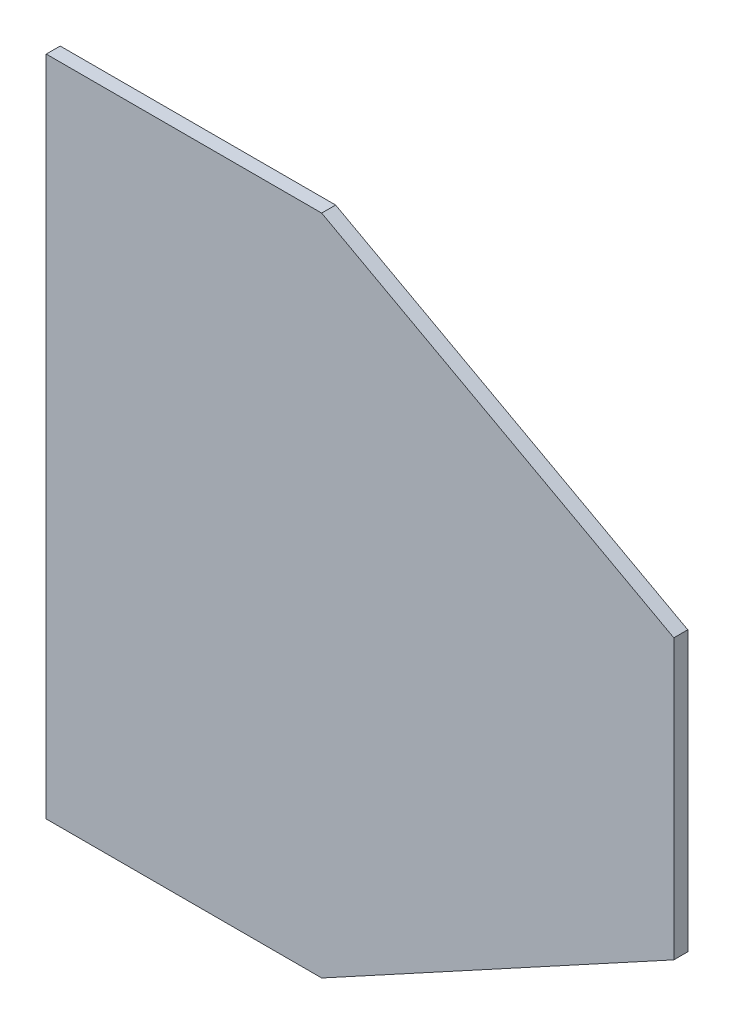
ISO-10303-21;
HEADER;
FILE_DESCRIPTION(('STEP AP214'),'2;1');
FILE_NAME('part.step','',(''),(''),'','','');
FILE_SCHEMA(('AUTOMOTIVE_DESIGN { 1 0 10303 214 1 1 1 1 }'));
ENDSEC;
DATA;
#1=APPLICATION_CONTEXT('core data for automotive mechanical design processes');
#2=APPLICATION_PROTOCOL_DEFINITION('international standard','automotive_design',2000,#1);
#3=PRODUCT_CONTEXT('',#1,'mechanical');
#4=PRODUCT('Part','Part','',(#3));
#5=PRODUCT_RELATED_PRODUCT_CATEGORY('part','',(#4));
#6=PRODUCT_DEFINITION_FORMATION('','',#4);
#7=PRODUCT_DEFINITION_CONTEXT('part definition',#1,'design');
#8=PRODUCT_DEFINITION('design','',#6,#7);
#9=PRODUCT_DEFINITION_SHAPE('','',#8);
#10=(LENGTH_UNIT() NAMED_UNIT(*) SI_UNIT(.MILLI.,.METRE.));
#11=(NAMED_UNIT(*) PLANE_ANGLE_UNIT() SI_UNIT($,.RADIAN.));
#12=(NAMED_UNIT(*) SI_UNIT($,.STERADIAN.) SOLID_ANGLE_UNIT());
#13=UNCERTAINTY_MEASURE_WITH_UNIT(LENGTH_MEASURE(1.E-05),#10,'distance_accuracy_value','');
#14=(GEOMETRIC_REPRESENTATION_CONTEXT(3) GLOBAL_UNCERTAINTY_ASSIGNED_CONTEXT((#13)) GLOBAL_UNIT_ASSIGNED_CONTEXT((#10,
#11,#12)) REPRESENTATION_CONTEXT('',''));
#15=CARTESIAN_POINT('',(0.,0.,0.));
#16=DIRECTION('',(0.,0.,1.));
#17=DIRECTION('',(1.,0.,0.));
#18=AXIS2_PLACEMENT_3D('',#15,#16,#17);
#19=CARTESIAN_POINT('',(136.000000002653,-8.99999999990882,4.));
#20=DIRECTION('',(-0.478242788883094,0.878227666884459,0.));
#21=DIRECTION('',(-0.878227666884459,-0.478242788883094,0.));
#22=AXIS2_PLACEMENT_3D('',#19,#20,#21);
#23=PLANE('',#22);
#24=DIRECTION('',(0.878227666884459,0.478242788883094,0.));
#25=VECTOR('',#24,1.);
#26=CARTESIAN_POINT('',(136.000000002653,-8.99999999990882,0.));
#27=LINE('',#26,#25);
#28=CARTESIAN_POINT('',(34.9999999996149,-63.9999999999088,0.));
#29=VERTEX_POINT('',#28);
#30=CARTESIAN_POINT('',(136.000000002653,-8.99999999990882,0.));
#31=VERTEX_POINT('',#30);
#32=EDGE_CURVE('E117',#29,#31,#27,.T.);
#33=ORIENTED_EDGE('',*,*,#32,.T.);
#34=DIRECTION('',(0.,0.,-1.));
#35=VECTOR('',#34,1.);
#36=CARTESIAN_POINT('',(136.000000002653,-8.99999999990882,4.));
#37=LINE('',#36,#35);
#38=CARTESIAN_POINT('',(136.000000002653,-8.99999999990882,4.));
#39=VERTEX_POINT('',#38);
#40=EDGE_CURVE('E11',#39,#31,#37,.T.);
#41=ORIENTED_EDGE('',*,*,#40,.F.);
#42=DIRECTION('',(0.878227666884459,0.478242788883094,0.));
#43=VECTOR('',#42,1.);
#44=CARTESIAN_POINT('',(136.000000002653,-8.99999999990882,4.));
#45=LINE('',#44,#43);
#46=CARTESIAN_POINT('',(34.9999999996149,-63.9999999999088,4.));
#47=VERTEX_POINT('',#46);
#48=EDGE_CURVE('E127',#47,#39,#45,.T.);
#49=ORIENTED_EDGE('',*,*,#48,.F.);
#50=DIRECTION('',(0.,0.,-1.));
#51=VECTOR('',#50,1.);
#52=CARTESIAN_POINT('',(34.9999999996149,-63.9999999999088,4.));
#53=LINE('',#52,#51);
#54=EDGE_CURVE('E113',#47,#29,#53,.T.);
#55=ORIENTED_EDGE('',*,*,#54,.T.);
#56=EDGE_LOOP('',(#33,#41,#49,#55));
#57=FACE_BOUND('',#56,.T.);
#58=ADVANCED_FACE('F33',(#57),#23,.F.);
#59=CARTESIAN_POINT('',(136.000000002653,71.0000000000912,4.));
#60=DIRECTION('',(-1.,0.,0.));
#61=DIRECTION('',(0.,0.,1.));
#62=AXIS2_PLACEMENT_3D('',#59,#60,#61);
#63=PLANE('',#62);
#64=DIRECTION('',(0.,1.,0.));
#65=VECTOR('',#64,1.);
#66=CARTESIAN_POINT('',(136.000000002653,71.0000000000912,0.));
#67=LINE('',#66,#65);
#68=CARTESIAN_POINT('',(136.000000002653,71.0000000000912,0.));
#69=VERTEX_POINT('',#68);
#70=EDGE_CURVE('E120',#31,#69,#67,.T.);
#71=ORIENTED_EDGE('',*,*,#70,.T.);
#72=DIRECTION('',(0.,0.,-1.));
#73=VECTOR('',#72,1.);
#74=CARTESIAN_POINT('',(136.000000002653,71.0000000000912,4.));
#75=LINE('',#74,#73);
#76=CARTESIAN_POINT('',(136.000000002653,71.0000000000912,4.));
#77=VERTEX_POINT('',#76);
#78=EDGE_CURVE('E41',#77,#69,#75,.T.);
#79=ORIENTED_EDGE('',*,*,#78,.F.);
#80=DIRECTION('',(0.,1.,0.));
#81=VECTOR('',#80,1.);
#82=CARTESIAN_POINT('',(136.000000002653,71.0000000000912,4.));
#83=LINE('',#82,#81);
#84=EDGE_CURVE('E86',#39,#77,#83,.T.);
#85=ORIENTED_EDGE('',*,*,#84,.F.);
#86=ORIENTED_EDGE('',*,*,#40,.T.);
#87=EDGE_LOOP('',(#71,#79,#85,#86));
#88=FACE_BOUND('',#87,.T.);
#89=ADVANCED_FACE('F151',(#88),#63,.F.);
#90=CARTESIAN_POINT('',(34.9999999995747,126.000000000091,4.));
#91=DIRECTION('',(-0.478242788882947,-0.878227666884539,0.));
#92=DIRECTION('',(0.878227666884539,-0.478242788882947,0.));
#93=AXIS2_PLACEMENT_3D('',#90,#91,#92);
#94=PLANE('',#93);
#95=DIRECTION('',(-0.878227666884539,0.478242788882947,0.));
#96=VECTOR('',#95,1.);
#97=CARTESIAN_POINT('',(34.9999999995747,126.000000000091,0.));
#98=LINE('',#97,#96);
#99=CARTESIAN_POINT('',(34.9999999995747,126.000000000091,0.));
#100=VERTEX_POINT('',#99);
#101=EDGE_CURVE('E122',#69,#100,#98,.T.);
#102=ORIENTED_EDGE('',*,*,#101,.T.);
#103=DIRECTION('',(0.,0.,-1.));
#104=VECTOR('',#103,1.);
#105=CARTESIAN_POINT('',(34.9999999995747,126.000000000091,4.));
#106=LINE('',#105,#104);
#107=CARTESIAN_POINT('',(34.9999999995747,126.000000000091,4.));
#108=VERTEX_POINT('',#107);
#109=EDGE_CURVE('E108',#108,#100,#106,.T.);
#110=ORIENTED_EDGE('',*,*,#109,.F.);
#111=DIRECTION('',(-0.878227666884539,0.478242788882947,0.));
#112=VECTOR('',#111,1.);
#113=CARTESIAN_POINT('',(34.9999999995747,126.000000000091,4.));
#114=LINE('',#113,#112);
#115=EDGE_CURVE('E99',#77,#108,#114,.T.);
#116=ORIENTED_EDGE('',*,*,#115,.F.);
#117=ORIENTED_EDGE('',*,*,#78,.T.);
#118=EDGE_LOOP('',(#102,#110,#116,#117));
#119=FACE_BOUND('',#118,.T.);
#120=ADVANCED_FACE('F133',(#119),#94,.F.);
#121=CARTESIAN_POINT('',(-43.9999999973474,126.000000000092,4.));
#122=DIRECTION('',(0.,-1.,0.));
#123=DIRECTION('',(1.,0.,0.));
#124=AXIS2_PLACEMENT_3D('',#121,#122,#123);
#125=PLANE('',#124);
#126=DIRECTION('',(-1.,0.,0.));
#127=VECTOR('',#126,1.);
#128=CARTESIAN_POINT('',(-43.9999999973474,126.000000000092,0.));
#129=LINE('',#128,#127);
#130=CARTESIAN_POINT('',(-43.9999999973474,126.000000000092,0.));
#131=VERTEX_POINT('',#130);
#132=EDGE_CURVE('E107',#100,#131,#129,.T.);
#133=ORIENTED_EDGE('',*,*,#132,.T.);
#134=DIRECTION('',(0.,0.,-1.));
#135=VECTOR('',#134,1.);
#136=CARTESIAN_POINT('',(-43.9999999973474,126.000000000092,4.));
#137=LINE('',#136,#135);
#138=CARTESIAN_POINT('',(-43.9999999973474,126.000000000092,4.));
#139=VERTEX_POINT('',#138);
#140=EDGE_CURVE('E104',#139,#131,#137,.T.);
#141=ORIENTED_EDGE('',*,*,#140,.F.);
#142=DIRECTION('',(-1.,0.,0.));
#143=VECTOR('',#142,1.);
#144=CARTESIAN_POINT('',(-43.9999999973474,126.000000000092,4.));
#145=LINE('',#144,#143);
#146=EDGE_CURVE('E93',#108,#139,#145,.T.);
#147=ORIENTED_EDGE('',*,*,#146,.F.);
#148=ORIENTED_EDGE('',*,*,#109,.T.);
#149=EDGE_LOOP('',(#133,#141,#147,#148));
#150=FACE_BOUND('',#149,.T.);
#151=ADVANCED_FACE('F105',(#150),#125,.F.);
#152=CARTESIAN_POINT('',(-43.9999999973474,-63.9999999999088,4.));
#153=DIRECTION('',(1.,0.,0.));
#154=DIRECTION('',(0.,0.,-1.));
#155=AXIS2_PLACEMENT_3D('',#152,#153,#154);
#156=PLANE('',#155);
#157=DIRECTION('',(0.,-1.,0.));
#158=VECTOR('',#157,1.);
#159=CARTESIAN_POINT('',(-43.9999999973474,-63.9999999999088,0.));
#160=LINE('',#159,#158);
#161=CARTESIAN_POINT('',(-43.9999999973474,-63.9999999999088,0.));
#162=VERTEX_POINT('',#161);
#163=EDGE_CURVE('E72',#131,#162,#160,.T.);
#164=ORIENTED_EDGE('',*,*,#163,.T.);
#165=DIRECTION('',(0.,0.,-1.));
#166=VECTOR('',#165,1.);
#167=CARTESIAN_POINT('',(-43.9999999973474,-63.9999999999088,4.));
#168=LINE('',#167,#166);
#169=CARTESIAN_POINT('',(-43.9999999973474,-63.9999999999088,4.));
#170=VERTEX_POINT('',#169);
#171=EDGE_CURVE('E109',#170,#162,#168,.T.);
#172=ORIENTED_EDGE('',*,*,#171,.F.);
#173=DIRECTION('',(0.,-1.,0.));
#174=VECTOR('',#173,1.);
#175=CARTESIAN_POINT('',(-43.9999999973474,-63.9999999999088,4.));
#176=LINE('',#175,#174);
#177=EDGE_CURVE('E97',#139,#170,#176,.T.);
#178=ORIENTED_EDGE('',*,*,#177,.F.);
#179=ORIENTED_EDGE('',*,*,#140,.T.);
#180=EDGE_LOOP('',(#164,#172,#178,#179));
#181=FACE_BOUND('',#180,.T.);
#182=ADVANCED_FACE('F111',(#181),#156,.F.);
#183=CARTESIAN_POINT('',(34.9999999996149,-63.9999999999088,4.));
#184=DIRECTION('',(0.,1.,0.));
#185=DIRECTION('',(-1.,0.,0.));
#186=AXIS2_PLACEMENT_3D('',#183,#184,#185);
#187=PLANE('',#186);
#188=DIRECTION('',(1.,0.,0.));
#189=VECTOR('',#188,1.);
#190=CARTESIAN_POINT('',(34.9999999996149,-63.9999999999088,0.));
#191=LINE('',#190,#189);
#192=EDGE_CURVE('E78',#162,#29,#191,.T.);
#193=ORIENTED_EDGE('',*,*,#192,.T.);
#194=ORIENTED_EDGE('',*,*,#54,.F.);
#195=DIRECTION('',(1.,0.,0.));
#196=VECTOR('',#195,1.);
#197=CARTESIAN_POINT('',(34.9999999996149,-63.9999999999088,4.));
#198=LINE('',#197,#196);
#199=EDGE_CURVE('E49',#170,#47,#198,.T.);
#200=ORIENTED_EDGE('',*,*,#199,.F.);
#201=ORIENTED_EDGE('',*,*,#171,.T.);
#202=EDGE_LOOP('',(#193,#194,#200,#201));
#203=FACE_BOUND('',#202,.T.);
#204=ADVANCED_FACE('F140',(#203),#187,.F.);
#205=CARTESIAN_POINT('',(0.,0.,4.));
#206=DIRECTION('',(0.,0.,-1.));
#207=DIRECTION('',(-1.,0.,0.));
#208=AXIS2_PLACEMENT_3D('',#205,#206,#207);
#209=PLANE('',#208);
#210=ORIENTED_EDGE('',*,*,#48,.T.);
#211=ORIENTED_EDGE('',*,*,#84,.T.);
#212=ORIENTED_EDGE('',*,*,#115,.T.);
#213=ORIENTED_EDGE('',*,*,#146,.T.);
#214=ORIENTED_EDGE('',*,*,#177,.T.);
#215=ORIENTED_EDGE('',*,*,#199,.T.);
#216=EDGE_LOOP('',(#210,#211,#212,#213,#214,#215));
#217=FACE_BOUND('',#216,.T.);
#218=ADVANCED_FACE('F95',(#217),#209,.F.);
#219=CARTESIAN_POINT('',(0.,0.,0.));
#220=DIRECTION('',(0.,0.,-1.));
#221=DIRECTION('',(-1.,0.,0.));
#222=AXIS2_PLACEMENT_3D('',#219,#220,#221);
#223=PLANE('',#222);
#224=ORIENTED_EDGE('',*,*,#32,.F.);
#225=ORIENTED_EDGE('',*,*,#192,.F.);
#226=ORIENTED_EDGE('',*,*,#163,.F.);
#227=ORIENTED_EDGE('',*,*,#132,.F.);
#228=ORIENTED_EDGE('',*,*,#101,.F.);
#229=ORIENTED_EDGE('',*,*,#70,.F.);
#230=EDGE_LOOP('',(#224,#225,#226,#227,#228,#229));
#231=FACE_BOUND('',#230,.T.);
#232=ADVANCED_FACE('F136',(#231),#223,.T.);
#233=CLOSED_SHELL('',(#58,#89,#120,#151,#182,#204,#218,#232));
#234=MANIFOLD_SOLID_BREP('B2',#233);
#235=ADVANCED_BREP_SHAPE_REPRESENTATION('',(#18,#234),#14);
#236=SHAPE_DEFINITION_REPRESENTATION(#9,#235);
ENDSEC;
END-ISO-10303-21;
